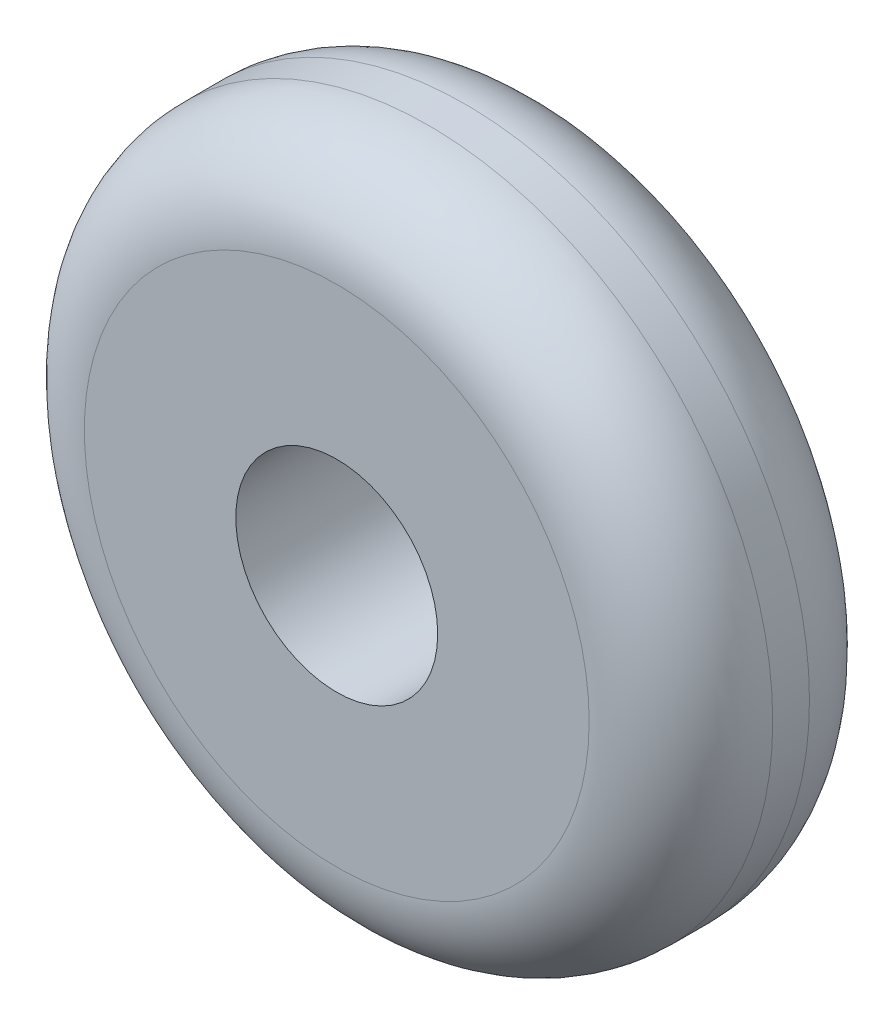
ISO-10303-21;
HEADER;
FILE_DESCRIPTION(('STEP AP214'),'2;1');
FILE_NAME('part.step','',(''),(''),'','','');
FILE_SCHEMA(('AUTOMOTIVE_DESIGN { 1 0 10303 214 1 1 1 1 }'));
ENDSEC;
DATA;
#1=APPLICATION_CONTEXT('core data for automotive mechanical design processes');
#2=APPLICATION_PROTOCOL_DEFINITION('international standard','automotive_design',2000,#1);
#3=PRODUCT_CONTEXT('',#1,'mechanical');
#4=PRODUCT('Part','Part','',(#3));
#5=PRODUCT_RELATED_PRODUCT_CATEGORY('part','',(#4));
#6=PRODUCT_DEFINITION_FORMATION('','',#4);
#7=PRODUCT_DEFINITION_CONTEXT('part definition',#1,'design');
#8=PRODUCT_DEFINITION('design','',#6,#7);
#9=PRODUCT_DEFINITION_SHAPE('','',#8);
#10=(LENGTH_UNIT() NAMED_UNIT(*) SI_UNIT(.MILLI.,.METRE.));
#11=(NAMED_UNIT(*) PLANE_ANGLE_UNIT() SI_UNIT($,.RADIAN.));
#12=(NAMED_UNIT(*) SI_UNIT($,.STERADIAN.) SOLID_ANGLE_UNIT());
#13=UNCERTAINTY_MEASURE_WITH_UNIT(LENGTH_MEASURE(1.E-05),#10,'distance_accuracy_value','');
#14=(GEOMETRIC_REPRESENTATION_CONTEXT(3) GLOBAL_UNCERTAINTY_ASSIGNED_CONTEXT((#13)) GLOBAL_UNIT_ASSIGNED_CONTEXT((#10,
#11,#12)) REPRESENTATION_CONTEXT('',''));
#15=CARTESIAN_POINT('',(0.,0.,0.));
#16=DIRECTION('',(0.,0.,1.));
#17=DIRECTION('',(1.,0.,0.));
#18=AXIS2_PLACEMENT_3D('',#15,#16,#17);
#19=CARTESIAN_POINT('',(0.,0.,24.));
#20=DIRECTION('',(0.,0.,1.));
#21=DIRECTION('',(1.,0.,0.));
#22=AXIS2_PLACEMENT_3D('',#19,#20,#21);
#23=PLANE('',#22);
#24=CARTESIAN_POINT('',(0.,0.,24.));
#25=DIRECTION('',(0.,0.,1.));
#26=DIRECTION('',(1.,0.,0.));
#27=AXIS2_PLACEMENT_3D('',#24,#25,#26);
#28=CIRCLE('',#27,27.5);
#29=CARTESIAN_POINT('',(27.5,0.,24.));
#30=VERTEX_POINT('',#29);
#31=EDGE_CURVE('E10',#30,#30,#28,.T.);
#32=ORIENTED_EDGE('',*,*,#31,.T.);
#33=EDGE_LOOP('',(#32));
#34=FACE_BOUND('',#33,.T.);
#35=CARTESIAN_POINT('',(0.,0.,24.));
#36=DIRECTION('',(0.,0.,1.));
#37=DIRECTION('',(1.,0.,0.));
#38=AXIS2_PLACEMENT_3D('',#35,#36,#37);
#39=CIRCLE('',#38,11.);
#40=CARTESIAN_POINT('',(11.,0.,24.));
#41=VERTEX_POINT('',#40);
#42=EDGE_CURVE('E53',#41,#41,#39,.T.);
#43=ORIENTED_EDGE('',*,*,#42,.F.);
#44=EDGE_LOOP('',(#43));
#45=FACE_BOUND('',#44,.T.);
#46=ADVANCED_FACE('F33',(#34,#45),#23,.T.);
#47=CARTESIAN_POINT('',(0.,0.,0.));
#48=DIRECTION('',(0.,0.,1.));
#49=DIRECTION('',(1.,0.,0.));
#50=AXIS2_PLACEMENT_3D('',#47,#48,#49);
#51=PLANE('',#50);
#52=CARTESIAN_POINT('',(0.,0.,0.));
#53=DIRECTION('',(0.,0.,1.));
#54=DIRECTION('',(1.,0.,0.));
#55=AXIS2_PLACEMENT_3D('',#52,#53,#54);
#56=CIRCLE('',#55,27.5);
#57=CARTESIAN_POINT('',(27.5,0.,0.));
#58=VERTEX_POINT('',#57);
#59=EDGE_CURVE('E40',#58,#58,#56,.F.);
#60=ORIENTED_EDGE('',*,*,#59,.T.);
#61=EDGE_LOOP('',(#60));
#62=FACE_BOUND('',#61,.T.);
#63=CARTESIAN_POINT('',(0.,0.,0.));
#64=DIRECTION('',(0.,0.,1.));
#65=DIRECTION('',(1.,0.,0.));
#66=AXIS2_PLACEMENT_3D('',#63,#64,#65);
#67=CIRCLE('',#66,11.);
#68=CARTESIAN_POINT('',(11.,0.,0.));
#69=VERTEX_POINT('',#68);
#70=EDGE_CURVE('E54',#69,#69,#67,.T.);
#71=ORIENTED_EDGE('',*,*,#70,.T.);
#72=EDGE_LOOP('',(#71));
#73=FACE_BOUND('',#72,.T.);
#74=ADVANCED_FACE('F64',(#62,#73),#51,.F.);
#75=CARTESIAN_POINT('',(0.,0.,24.));
#76=DIRECTION('',(0.,0.,-1.));
#77=DIRECTION('',(-1.,0.,0.));
#78=AXIS2_PLACEMENT_3D('',#75,#76,#77);
#79=CYLINDRICAL_SURFACE('',#78,37.5);
#80=CARTESIAN_POINT('',(0.,0.,10.));
#81=DIRECTION('',(0.,0.,1.));
#82=DIRECTION('',(1.,0.,0.));
#83=AXIS2_PLACEMENT_3D('',#80,#81,#82);
#84=CIRCLE('',#83,37.5);
#85=CARTESIAN_POINT('',(37.5,0.,10.));
#86=VERTEX_POINT('',#85);
#87=EDGE_CURVE('E44',#86,#86,#84,.T.);
#88=ORIENTED_EDGE('',*,*,#87,.T.);
#89=EDGE_LOOP('',(#88));
#90=FACE_BOUND('',#89,.T.);
#91=CARTESIAN_POINT('',(0.,0.,14.));
#92=DIRECTION('',(0.,0.,1.));
#93=DIRECTION('',(1.,0.,0.));
#94=AXIS2_PLACEMENT_3D('',#91,#92,#93);
#95=CIRCLE('',#94,37.5);
#96=CARTESIAN_POINT('',(37.5,0.,14.));
#97=VERTEX_POINT('',#96);
#98=EDGE_CURVE('E48',#97,#97,#95,.F.);
#99=ORIENTED_EDGE('',*,*,#98,.T.);
#100=EDGE_LOOP('',(#99));
#101=FACE_BOUND('',#100,.T.);
#102=ADVANCED_FACE('F69',(#90,#101),#79,.T.);
#103=CARTESIAN_POINT('',(0.,0.,24.));
#104=DIRECTION('',(0.,0.,-1.));
#105=DIRECTION('',(-1.,0.,0.));
#106=AXIS2_PLACEMENT_3D('',#103,#104,#105);
#107=CYLINDRICAL_SURFACE('',#106,11.);
#108=ORIENTED_EDGE('',*,*,#42,.T.);
#109=EDGE_LOOP('',(#108));
#110=FACE_BOUND('',#109,.T.);
#111=ORIENTED_EDGE('',*,*,#70,.F.);
#112=EDGE_LOOP('',(#111));
#113=FACE_BOUND('',#112,.T.);
#114=ADVANCED_FACE('F60',(#110,#113),#107,.F.);
#115=CARTESIAN_POINT('',(0.,0.,10.));
#116=DIRECTION('',(0.,0.,1.));
#117=DIRECTION('',(1.,0.,0.));
#118=AXIS2_PLACEMENT_3D('',#115,#116,#117);
#119=TOROIDAL_SURFACE('',#118,27.5,10.);
#120=ORIENTED_EDGE('',*,*,#59,.F.);
#121=EDGE_LOOP('',(#120));
#122=FACE_BOUND('',#121,.T.);
#123=ORIENTED_EDGE('',*,*,#87,.F.);
#124=EDGE_LOOP('',(#123));
#125=FACE_BOUND('',#124,.T.);
#126=ADVANCED_FACE('F75',(#122,#125),#119,.T.);
#127=CARTESIAN_POINT('',(0.,0.,14.));
#128=DIRECTION('',(0.,0.,1.));
#129=DIRECTION('',(1.,0.,0.));
#130=AXIS2_PLACEMENT_3D('',#127,#128,#129);
#131=TOROIDAL_SURFACE('',#130,27.5,10.);
#132=ORIENTED_EDGE('',*,*,#98,.F.);
#133=EDGE_LOOP('',(#132));
#134=FACE_BOUND('',#133,.T.);
#135=ORIENTED_EDGE('',*,*,#31,.F.);
#136=EDGE_LOOP('',(#135));
#137=FACE_BOUND('',#136,.T.);
#138=ADVANCED_FACE('F35',(#134,#137),#131,.T.);
#139=CLOSED_SHELL('',(#46,#74,#102,#114,#126,#138));
#140=MANIFOLD_SOLID_BREP('B2',#139);
#141=ADVANCED_BREP_SHAPE_REPRESENTATION('',(#18,#140),#14);
#142=SHAPE_DEFINITION_REPRESENTATION(#9,#141);
ENDSEC;
END-ISO-10303-21;
